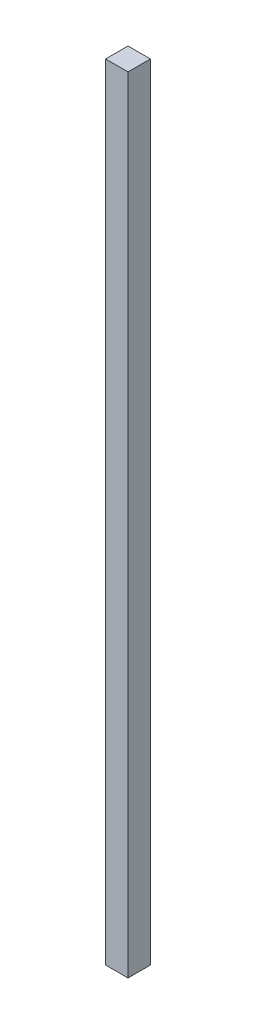
ISO-10303-21;
HEADER;
FILE_DESCRIPTION(('STEP AP214'),'2;1');
FILE_NAME('part.step','',(''),(''),'','','');
FILE_SCHEMA(('AUTOMOTIVE_DESIGN { 1 0 10303 214 1 1 1 1 }'));
ENDSEC;
DATA;
#1=APPLICATION_CONTEXT('core data for automotive mechanical design processes');
#2=APPLICATION_PROTOCOL_DEFINITION('international standard','automotive_design',2000,#1);
#3=PRODUCT_CONTEXT('',#1,'mechanical');
#4=PRODUCT('Part','Part','',(#3));
#5=PRODUCT_RELATED_PRODUCT_CATEGORY('part','',(#4));
#6=PRODUCT_DEFINITION_FORMATION('','',#4);
#7=PRODUCT_DEFINITION_CONTEXT('part definition',#1,'design');
#8=PRODUCT_DEFINITION('design','',#6,#7);
#9=PRODUCT_DEFINITION_SHAPE('','',#8);
#10=(LENGTH_UNIT() NAMED_UNIT(*) SI_UNIT(.MILLI.,.METRE.));
#11=(NAMED_UNIT(*) PLANE_ANGLE_UNIT() SI_UNIT($,.RADIAN.));
#12=(NAMED_UNIT(*) SI_UNIT($,.STERADIAN.) SOLID_ANGLE_UNIT());
#13=UNCERTAINTY_MEASURE_WITH_UNIT(LENGTH_MEASURE(1.E-05),#10,'distance_accuracy_value','');
#14=(GEOMETRIC_REPRESENTATION_CONTEXT(3) GLOBAL_UNCERTAINTY_ASSIGNED_CONTEXT((#13)) GLOBAL_UNIT_ASSIGNED_CONTEXT((#10,
#11,#12)) REPRESENTATION_CONTEXT('',''));
#15=CARTESIAN_POINT('',(0.,0.,0.));
#16=DIRECTION('',(0.,0.,1.));
#17=DIRECTION('',(1.,0.,0.));
#18=AXIS2_PLACEMENT_3D('',#15,#16,#17);
#19=CARTESIAN_POINT('',(-5.,350.,-5.));
#20=DIRECTION('',(1.,0.,0.));
#21=DIRECTION('',(0.,0.,-1.));
#22=AXIS2_PLACEMENT_3D('',#19,#20,#21);
#23=PLANE('',#22);
#24=DIRECTION('',(0.,0.,1.));
#25=VECTOR('',#24,1.);
#26=CARTESIAN_POINT('',(-5.,0.,-5.));
#27=LINE('',#26,#25);
#28=CARTESIAN_POINT('',(-5.,0.,-5.));
#29=VERTEX_POINT('',#28);
#30=CARTESIAN_POINT('',(-5.,0.,5.));
#31=VERTEX_POINT('',#30);
#32=EDGE_CURVE('E96',#29,#31,#27,.T.);
#33=ORIENTED_EDGE('',*,*,#32,.T.);
#34=DIRECTION('',(0.,-1.,0.));
#35=VECTOR('',#34,1.);
#36=CARTESIAN_POINT('',(-5.,350.,5.));
#37=LINE('',#36,#35);
#38=CARTESIAN_POINT('',(-5.,350.,5.));
#39=VERTEX_POINT('',#38);
#40=EDGE_CURVE('E11',#39,#31,#37,.T.);
#41=ORIENTED_EDGE('',*,*,#40,.F.);
#42=DIRECTION('',(0.,0.,1.));
#43=VECTOR('',#42,1.);
#44=CARTESIAN_POINT('',(-5.,350.,-5.));
#45=LINE('',#44,#43);
#46=CARTESIAN_POINT('',(-5.,350.,-5.));
#47=VERTEX_POINT('',#46);
#48=EDGE_CURVE('E84',#47,#39,#45,.T.);
#49=ORIENTED_EDGE('',*,*,#48,.F.);
#50=DIRECTION('',(0.,-1.,0.));
#51=VECTOR('',#50,1.);
#52=CARTESIAN_POINT('',(-5.,350.,-5.));
#53=LINE('',#52,#51);
#54=EDGE_CURVE('E92',#47,#29,#53,.T.);
#55=ORIENTED_EDGE('',*,*,#54,.T.);
#56=EDGE_LOOP('',(#33,#41,#49,#55));
#57=FACE_BOUND('',#56,.T.);
#58=ADVANCED_FACE('F33',(#57),#23,.F.);
#59=CARTESIAN_POINT('',(-5.,350.,5.));
#60=DIRECTION('',(0.,0.,-1.));
#61=DIRECTION('',(-1.,0.,0.));
#62=AXIS2_PLACEMENT_3D('',#59,#60,#61);
#63=PLANE('',#62);
#64=DIRECTION('',(1.,0.,0.));
#65=VECTOR('',#64,1.);
#66=CARTESIAN_POINT('',(-5.,0.,5.));
#67=LINE('',#66,#65);
#68=CARTESIAN_POINT('',(5.,0.,5.));
#69=VERTEX_POINT('',#68);
#70=EDGE_CURVE('E88',#31,#69,#67,.T.);
#71=ORIENTED_EDGE('',*,*,#70,.T.);
#72=DIRECTION('',(0.,-1.,0.));
#73=VECTOR('',#72,1.);
#74=CARTESIAN_POINT('',(5.,350.,5.));
#75=LINE('',#74,#73);
#76=CARTESIAN_POINT('',(5.,350.,5.));
#77=VERTEX_POINT('',#76);
#78=EDGE_CURVE('E41',#77,#69,#75,.T.);
#79=ORIENTED_EDGE('',*,*,#78,.F.);
#80=DIRECTION('',(1.,0.,0.));
#81=VECTOR('',#80,1.);
#82=CARTESIAN_POINT('',(-5.,350.,5.));
#83=LINE('',#82,#81);
#84=EDGE_CURVE('E79',#39,#77,#83,.T.);
#85=ORIENTED_EDGE('',*,*,#84,.F.);
#86=ORIENTED_EDGE('',*,*,#40,.T.);
#87=EDGE_LOOP('',(#71,#79,#85,#86));
#88=FACE_BOUND('',#87,.T.);
#89=ADVANCED_FACE('F87',(#88),#63,.F.);
#90=CARTESIAN_POINT('',(5.,350.,-5.));
#91=DIRECTION('',(-1.,0.,0.));
#92=DIRECTION('',(0.,0.,1.));
#93=AXIS2_PLACEMENT_3D('',#90,#91,#92);
#94=PLANE('',#93);
#95=DIRECTION('',(0.,0.,-1.));
#96=VECTOR('',#95,1.);
#97=CARTESIAN_POINT('',(5.,0.,-5.));
#98=LINE('',#97,#96);
#99=CARTESIAN_POINT('',(5.,0.,-5.));
#100=VERTEX_POINT('',#99);
#101=EDGE_CURVE('E66',#69,#100,#98,.T.);
#102=ORIENTED_EDGE('',*,*,#101,.T.);
#103=DIRECTION('',(0.,-1.,0.));
#104=VECTOR('',#103,1.);
#105=CARTESIAN_POINT('',(5.,350.,-5.));
#106=LINE('',#105,#104);
#107=CARTESIAN_POINT('',(5.,350.,-5.));
#108=VERTEX_POINT('',#107);
#109=EDGE_CURVE('E89',#108,#100,#106,.T.);
#110=ORIENTED_EDGE('',*,*,#109,.F.);
#111=DIRECTION('',(0.,0.,-1.));
#112=VECTOR('',#111,1.);
#113=CARTESIAN_POINT('',(5.,350.,-5.));
#114=LINE('',#113,#112);
#115=EDGE_CURVE('E82',#77,#108,#114,.T.);
#116=ORIENTED_EDGE('',*,*,#115,.F.);
#117=ORIENTED_EDGE('',*,*,#78,.T.);
#118=EDGE_LOOP('',(#102,#110,#116,#117));
#119=FACE_BOUND('',#118,.T.);
#120=ADVANCED_FACE('F90',(#119),#94,.F.);
#121=CARTESIAN_POINT('',(-5.,350.,-5.));
#122=DIRECTION('',(0.,0.,1.));
#123=DIRECTION('',(1.,0.,0.));
#124=AXIS2_PLACEMENT_3D('',#121,#122,#123);
#125=PLANE('',#124);
#126=DIRECTION('',(-1.,0.,0.));
#127=VECTOR('',#126,1.);
#128=CARTESIAN_POINT('',(-5.,0.,-5.));
#129=LINE('',#128,#127);
#130=EDGE_CURVE('E72',#100,#29,#129,.T.);
#131=ORIENTED_EDGE('',*,*,#130,.T.);
#132=ORIENTED_EDGE('',*,*,#54,.F.);
#133=DIRECTION('',(-1.,0.,0.));
#134=VECTOR('',#133,1.);
#135=CARTESIAN_POINT('',(-5.,350.,-5.));
#136=LINE('',#135,#134);
#137=EDGE_CURVE('E49',#108,#47,#136,.T.);
#138=ORIENTED_EDGE('',*,*,#137,.F.);
#139=ORIENTED_EDGE('',*,*,#109,.T.);
#140=EDGE_LOOP('',(#131,#132,#138,#139));
#141=FACE_BOUND('',#140,.T.);
#142=ADVANCED_FACE('F103',(#141),#125,.F.);
#143=CARTESIAN_POINT('',(0.,350.,0.));
#144=DIRECTION('',(0.,1.,0.));
#145=DIRECTION('',(0.,0.,1.));
#146=AXIS2_PLACEMENT_3D('',#143,#144,#145);
#147=PLANE('',#146);
#148=ORIENTED_EDGE('',*,*,#48,.T.);
#149=ORIENTED_EDGE('',*,*,#84,.T.);
#150=ORIENTED_EDGE('',*,*,#115,.T.);
#151=ORIENTED_EDGE('',*,*,#137,.T.);
#152=EDGE_LOOP('',(#148,#149,#150,#151));
#153=FACE_BOUND('',#152,.T.);
#154=ADVANCED_FACE('F80',(#153),#147,.T.);
#155=CARTESIAN_POINT('',(0.,0.,0.));
#156=DIRECTION('',(0.,1.,0.));
#157=DIRECTION('',(0.,0.,1.));
#158=AXIS2_PLACEMENT_3D('',#155,#156,#157);
#159=PLANE('',#158);
#160=ORIENTED_EDGE('',*,*,#32,.F.);
#161=ORIENTED_EDGE('',*,*,#130,.F.);
#162=ORIENTED_EDGE('',*,*,#101,.F.);
#163=ORIENTED_EDGE('',*,*,#70,.F.);
#164=EDGE_LOOP('',(#160,#161,#162,#163));
#165=FACE_BOUND('',#164,.T.);
#166=ADVANCED_FACE('F106',(#165),#159,.F.);
#167=CLOSED_SHELL('',(#58,#89,#120,#142,#154,#166));
#168=MANIFOLD_SOLID_BREP('B2',#167);
#169=ADVANCED_BREP_SHAPE_REPRESENTATION('',(#18,#168),#14);
#170=SHAPE_DEFINITION_REPRESENTATION(#9,#169);
ENDSEC;
END-ISO-10303-21;
